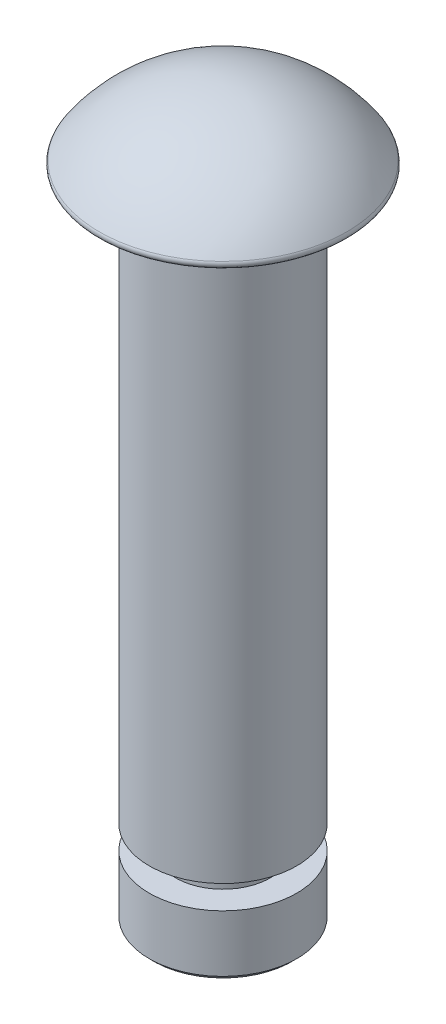
ISO-10303-21;
HEADER;
FILE_DESCRIPTION(('STEP AP214'),'2;1');
FILE_NAME('part.step','',(''),(''),'','','');
FILE_SCHEMA(('AUTOMOTIVE_DESIGN { 1 0 10303 214 1 1 1 1 }'));
ENDSEC;
DATA;
#1=APPLICATION_CONTEXT('core data for automotive mechanical design processes');
#2=APPLICATION_PROTOCOL_DEFINITION('international standard','automotive_design',2000,#1);
#3=PRODUCT_CONTEXT('',#1,'mechanical');
#4=PRODUCT('Part','Part','',(#3));
#5=PRODUCT_RELATED_PRODUCT_CATEGORY('part','',(#4));
#6=PRODUCT_DEFINITION_FORMATION('','',#4);
#7=PRODUCT_DEFINITION_CONTEXT('part definition',#1,'design');
#8=PRODUCT_DEFINITION('design','',#6,#7);
#9=PRODUCT_DEFINITION_SHAPE('','',#8);
#10=(LENGTH_UNIT() NAMED_UNIT(*) SI_UNIT(.MILLI.,.METRE.));
#11=(NAMED_UNIT(*) PLANE_ANGLE_UNIT() SI_UNIT($,.RADIAN.));
#12=(NAMED_UNIT(*) SI_UNIT($,.STERADIAN.) SOLID_ANGLE_UNIT());
#13=UNCERTAINTY_MEASURE_WITH_UNIT(LENGTH_MEASURE(1.E-05),#10,'distance_accuracy_value','');
#14=(GEOMETRIC_REPRESENTATION_CONTEXT(3) GLOBAL_UNCERTAINTY_ASSIGNED_CONTEXT((#13)) GLOBAL_UNIT_ASSIGNED_CONTEXT((#10,
#11,#12)) REPRESENTATION_CONTEXT('',''));
#15=CARTESIAN_POINT('',(0.,0.,0.));
#16=DIRECTION('',(0.,0.,1.));
#17=DIRECTION('',(1.,0.,0.));
#18=AXIS2_PLACEMENT_3D('',#15,#16,#17);
#19=CARTESIAN_POINT('',(0.,-9.7409,0.));
#20=DIRECTION('',(0.,1.,0.));
#21=DIRECTION('',(-1.,0.,0.));
#22=AXIS2_PLACEMENT_3D('',#19,#20,#21);
#23=PLANE('',#22);
#24=CARTESIAN_POINT('',(0.,-9.74089999994021,0.));
#25=DIRECTION('',(0.,1.,0.));
#26=DIRECTION('',(-1.,0.,0.));
#27=AXIS2_PLACEMENT_3D('',#24,#25,#26);
#28=CIRCLE('',#27,1.85620000002018);
#29=CARTESIAN_POINT('',(-1.85620000002018,-9.74089999994021,0.));
#30=VERTEX_POINT('',#29);
#31=EDGE_CURVE('E133',#30,#30,#28,.T.);
#32=ORIENTED_EDGE('',*,*,#31,.F.);
#33=EDGE_LOOP('',(#32));
#34=FACE_BOUND('',#33,.T.);
#35=ADVANCED_FACE('F17',(#34),#23,.F.);
#36=CARTESIAN_POINT('',(0.,-9.61589999997159,0.));
#37=DIRECTION('',(0.,1.,0.));
#38=DIRECTION('',(-1.,0.,0.));
#39=AXIS2_PLACEMENT_3D('',#36,#37,#38);
#40=CONICAL_SURFACE('',#39,1.9811999999888,0.785398163397448);
#41=CARTESIAN_POINT('',(0.,-9.6159,0.));
#42=DIRECTION('',(0.,1.,0.));
#43=DIRECTION('',(-1.,0.,0.));
#44=AXIS2_PLACEMENT_3D('',#41,#42,#43);
#45=CIRCLE('',#44,1.98120000000001);
#46=CARTESIAN_POINT('',(-1.98120000000001,-9.6159,0.));
#47=VERTEX_POINT('',#46);
#48=EDGE_CURVE('E89',#47,#47,#45,.T.);
#49=ORIENTED_EDGE('',*,*,#48,.F.);
#50=EDGE_LOOP('',(#49));
#51=FACE_BOUND('',#50,.T.);
#52=ORIENTED_EDGE('',*,*,#31,.T.);
#53=EDGE_LOOP('',(#52));
#54=FACE_BOUND('',#53,.T.);
#55=ADVANCED_FACE('F100',(#51,#54),#40,.T.);
#56=CARTESIAN_POINT('',(0.,9.74089999999998,0.));
#57=DIRECTION('',(0.,1.,0.));
#58=DIRECTION('',(-1.,0.,0.));
#59=AXIS2_PLACEMENT_3D('',#56,#57,#58);
#60=CYLINDRICAL_SURFACE('',#59,1.98120000000001);
#61=CARTESIAN_POINT('',(0.,-8.0899,0.));
#62=DIRECTION('',(0.,1.,0.));
#63=DIRECTION('',(-1.,0.,0.));
#64=AXIS2_PLACEMENT_3D('',#61,#62,#63);
#65=CIRCLE('',#64,1.98120000000001);
#66=CARTESIAN_POINT('',(-1.98120000000001,-8.08989999999999,0.));
#67=VERTEX_POINT('',#66);
#68=EDGE_CURVE('E130',#67,#67,#65,.F.);
#69=ORIENTED_EDGE('',*,*,#68,.T.);
#70=EDGE_LOOP('',(#69));
#71=FACE_BOUND('',#70,.T.);
#72=ORIENTED_EDGE('',*,*,#48,.T.);
#73=EDGE_LOOP('',(#72));
#74=FACE_BOUND('',#73,.T.);
#75=ADVANCED_FACE('F97',(#71,#74),#60,.T.);
#76=CARTESIAN_POINT('',(1.9812,-8.0899,0.));
#77=DIRECTION('',(0.,-1.,0.));
#78=DIRECTION('',(1.,0.,0.));
#79=AXIS2_PLACEMENT_3D('',#76,#77,#78);
#80=PLANE('',#79);
#81=ORIENTED_EDGE('',*,*,#68,.F.);
#82=EDGE_LOOP('',(#81));
#83=FACE_BOUND('',#82,.T.);
#84=CARTESIAN_POINT('',(0.,-8.0899,0.));
#85=DIRECTION('',(0.,1.,0.));
#86=DIRECTION('',(-1.,0.,0.));
#87=AXIS2_PLACEMENT_3D('',#84,#85,#86);
#88=CIRCLE('',#87,1.27000000000001);
#89=CARTESIAN_POINT('',(-1.27000000000001,-8.0899,0.));
#90=VERTEX_POINT('',#89);
#91=EDGE_CURVE('E127',#90,#90,#88,.T.);
#92=ORIENTED_EDGE('',*,*,#91,.F.);
#93=EDGE_LOOP('',(#92));
#94=FACE_BOUND('',#93,.T.);
#95=ADVANCED_FACE('F93',(#83,#94),#80,.F.);
#96=CARTESIAN_POINT('',(0.,5.71236103896104,0.));
#97=DIRECTION('',(1.,0.,0.));
#98=DIRECTION('',(0.,-1.,0.));
#99=AXIS2_PLACEMENT_3D('',#96,#97,#98);
#100=SPHERICAL_SURFACE('',#99,4.02853896103896);
#101=CARTESIAN_POINT('',(0.,7.98047648986517,0.));
#102=DIRECTION('',(0.,1.,0.));
#103=DIRECTION('',(-1.,0.,0.));
#104=AXIS2_PLACEMENT_3D('',#101,#102,#103);
#105=CIRCLE('',#104,3.32938109293285);
#106=CARTESIAN_POINT('',(-3.32938109293286,7.98047648986517,0.));
#107=VERTEX_POINT('',#106);
#108=EDGE_CURVE('E124',#107,#107,#105,.F.);
#109=ORIENTED_EDGE('',*,*,#108,.F.);
#110=EDGE_LOOP('',(#109));
#111=FACE_BOUND('',#110,.T.);
#112=ADVANCED_FACE('F90',(#111),#100,.T.);
#113=CARTESIAN_POINT('',(0.,9.74089999999998,0.));
#114=DIRECTION('',(0.,1.,0.));
#115=DIRECTION('',(-1.,0.,0.));
#116=AXIS2_PLACEMENT_3D('',#113,#114,#115);
#117=CYLINDRICAL_SURFACE('',#116,1.27000000000001);
#118=CARTESIAN_POINT('',(0.,-7.4549,0.));
#119=DIRECTION('',(0.,1.,0.));
#120=DIRECTION('',(-1.,0.,0.));
#121=AXIS2_PLACEMENT_3D('',#118,#119,#120);
#122=CIRCLE('',#121,1.27000000000001);
#123=CARTESIAN_POINT('',(-1.27000000000001,-7.4549,0.));
#124=VERTEX_POINT('',#123);
#125=EDGE_CURVE('E46',#124,#124,#122,.F.);
#126=ORIENTED_EDGE('',*,*,#125,.T.);
#127=EDGE_LOOP('',(#126));
#128=FACE_BOUND('',#127,.T.);
#129=ORIENTED_EDGE('',*,*,#91,.T.);
#130=EDGE_LOOP('',(#129));
#131=FACE_BOUND('',#130,.T.);
#132=ADVANCED_FACE('F76',(#128,#131),#117,.T.);
#133=CARTESIAN_POINT('',(0.,7.91009999999999,0.));
#134=DIRECTION('',(0.,1.,0.));
#135=DIRECTION('',(-1.,0.,0.));
#136=AXIS2_PLACEMENT_3D('',#133,#134,#135);
#137=TOROIDAL_SURFACE('',#136,3.22607499594794,0.125);
#138=CARTESIAN_POINT('',(0.,7.78509999999999,0.));
#139=DIRECTION('',(0.,1.,0.));
#140=DIRECTION('',(-1.,0.,0.));
#141=AXIS2_PLACEMENT_3D('',#138,#139,#140);
#142=CIRCLE('',#141,3.22607499594794);
#143=CARTESIAN_POINT('',(-3.22607499594795,7.7851,0.));
#144=VERTEX_POINT('',#143);
#145=CARTESIAN_POINT('',(3.22607499594794,7.78509999999999,0.));
#146=VERTEX_POINT('',#145);
#147=EDGE_CURVE('E34',#144,#146,#142,.T.);
#148=ORIENTED_EDGE('',*,*,#147,.T.);
#149=CARTESIAN_POINT('',(0.,7.78509999999999,0.));
#150=DIRECTION('',(0.,1.,0.));
#151=DIRECTION('',(1.,0.,0.));
#152=AXIS2_PLACEMENT_3D('',#149,#150,#151);
#153=CIRCLE('',#152,3.22607499594794);
#154=EDGE_CURVE('E36',#146,#144,#153,.T.);
#155=ORIENTED_EDGE('',*,*,#154,.T.);
#156=EDGE_LOOP('',(#148,#155));
#157=FACE_BOUND('',#156,.T.);
#158=ORIENTED_EDGE('',*,*,#108,.T.);
#159=EDGE_LOOP('',(#158));
#160=FACE_BOUND('',#159,.T.);
#161=ADVANCED_FACE('F38',(#157,#160),#137,.T.);
#162=CARTESIAN_POINT('',(1.27,-7.4549,0.));
#163=DIRECTION('',(0.,1.,0.));
#164=DIRECTION('',(-1.,0.,0.));
#165=AXIS2_PLACEMENT_3D('',#162,#163,#164);
#166=PLANE('',#165);
#167=ORIENTED_EDGE('',*,*,#125,.F.);
#168=EDGE_LOOP('',(#167));
#169=FACE_BOUND('',#168,.T.);
#170=CARTESIAN_POINT('',(0.,-7.4549,0.));
#171=DIRECTION('',(0.,1.,0.));
#172=DIRECTION('',(-1.,0.,0.));
#173=AXIS2_PLACEMENT_3D('',#170,#171,#172);
#174=CIRCLE('',#173,1.9812);
#175=CARTESIAN_POINT('',(-1.9812,-7.4549,0.));
#176=VERTEX_POINT('',#175);
#177=EDGE_CURVE('E27',#176,#176,#174,.T.);
#178=ORIENTED_EDGE('',*,*,#177,.F.);
#179=EDGE_LOOP('',(#178));
#180=FACE_BOUND('',#179,.T.);
#181=ADVANCED_FACE('F62',(#169,#180),#166,.F.);
#182=CARTESIAN_POINT('',(1.9812,7.7851,0.));
#183=DIRECTION('',(0.,1.,0.));
#184=DIRECTION('',(-1.,0.,0.));
#185=AXIS2_PLACEMENT_3D('',#182,#183,#184);
#186=PLANE('',#185);
#187=CARTESIAN_POINT('',(0.,7.7851,0.));
#188=DIRECTION('',(0.,1.,0.));
#189=DIRECTION('',(-1.,0.,0.));
#190=AXIS2_PLACEMENT_3D('',#187,#188,#189);
#191=CIRCLE('',#190,1.9812);
#192=CARTESIAN_POINT('',(-1.98119999999999,7.7851,0.));
#193=VERTEX_POINT('',#192);
#194=EDGE_CURVE('E11',#193,#193,#191,.F.);
#195=ORIENTED_EDGE('',*,*,#194,.F.);
#196=EDGE_LOOP('',(#195));
#197=FACE_BOUND('',#196,.T.);
#198=ORIENTED_EDGE('',*,*,#147,.F.);
#199=ORIENTED_EDGE('',*,*,#154,.F.);
#200=EDGE_LOOP('',(#198,#199));
#201=FACE_BOUND('',#200,.T.);
#202=ADVANCED_FACE('F45',(#197,#201),#186,.F.);
#203=CARTESIAN_POINT('',(0.,9.74089999999998,0.));
#204=DIRECTION('',(0.,1.,0.));
#205=DIRECTION('',(-1.,0.,0.));
#206=AXIS2_PLACEMENT_3D('',#203,#204,#205);
#207=CYLINDRICAL_SURFACE('',#206,1.9812);
#208=ORIENTED_EDGE('',*,*,#194,.T.);
#209=EDGE_LOOP('',(#208));
#210=FACE_BOUND('',#209,.T.);
#211=ORIENTED_EDGE('',*,*,#177,.T.);
#212=EDGE_LOOP('',(#211));
#213=FACE_BOUND('',#212,.T.);
#214=ADVANCED_FACE('F61',(#210,#213),#207,.T.);
#215=CLOSED_SHELL('',(#35,#55,#75,#95,#112,#132,#161,#181,#202,#214));
#216=MANIFOLD_SOLID_BREP('B1',#215);
#217=ADVANCED_BREP_SHAPE_REPRESENTATION('',(#18,#216),#14);
#218=SHAPE_DEFINITION_REPRESENTATION(#9,#217);
ENDSEC;
END-ISO-10303-21;
